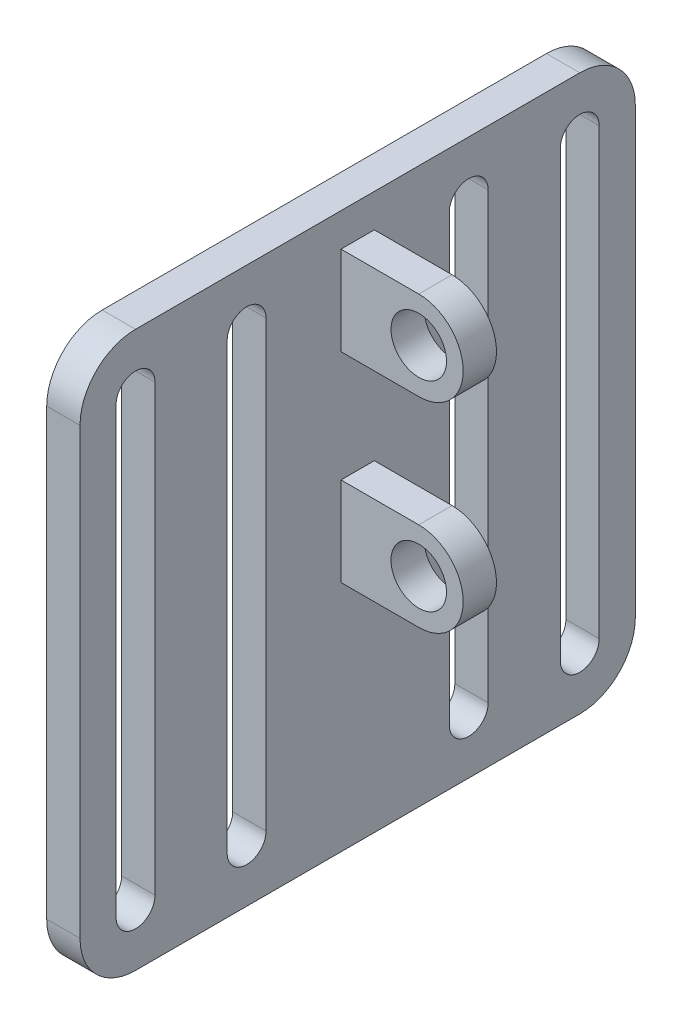
ISO-10303-21;
HEADER;
FILE_DESCRIPTION(('STEP AP214'),'2;1');
FILE_NAME('part.step','',(''),(''),'','','');
FILE_SCHEMA(('AUTOMOTIVE_DESIGN { 1 0 10303 214 1 1 1 1 }'));
ENDSEC;
DATA;
#1=APPLICATION_CONTEXT('core data for automotive mechanical design processes');
#2=APPLICATION_PROTOCOL_DEFINITION('international standard','automotive_design',2000,#1);
#3=PRODUCT_CONTEXT('',#1,'mechanical');
#4=PRODUCT('Part','Part','',(#3));
#5=PRODUCT_RELATED_PRODUCT_CATEGORY('part','',(#4));
#6=PRODUCT_DEFINITION_FORMATION('','',#4);
#7=PRODUCT_DEFINITION_CONTEXT('part definition',#1,'design');
#8=PRODUCT_DEFINITION('design','',#6,#7);
#9=PRODUCT_DEFINITION_SHAPE('','',#8);
#10=(LENGTH_UNIT() NAMED_UNIT(*) SI_UNIT(.MILLI.,.METRE.));
#11=(NAMED_UNIT(*) PLANE_ANGLE_UNIT() SI_UNIT($,.RADIAN.));
#12=(NAMED_UNIT(*) SI_UNIT($,.STERADIAN.) SOLID_ANGLE_UNIT());
#13=UNCERTAINTY_MEASURE_WITH_UNIT(LENGTH_MEASURE(1.E-05),#10,'distance_accuracy_value','');
#14=(GEOMETRIC_REPRESENTATION_CONTEXT(3) GLOBAL_UNCERTAINTY_ASSIGNED_CONTEXT((#13)) GLOBAL_UNIT_ASSIGNED_CONTEXT((#10,
#11,#12)) REPRESENTATION_CONTEXT('',''));
#15=CARTESIAN_POINT('',(0.,0.,0.));
#16=DIRECTION('',(0.,0.,1.));
#17=DIRECTION('',(1.,0.,0.));
#18=AXIS2_PLACEMENT_3D('',#15,#16,#17);
#19=CARTESIAN_POINT('',(3.,0.,-25.));
#20=DIRECTION('',(0.,0.,-1.));
#21=DIRECTION('',(0.,1.,0.));
#22=AXIS2_PLACEMENT_3D('',#19,#20,#21);
#23=PLANE('',#22);
#24=DIRECTION('',(0.,-1.,0.));
#25=VECTOR('',#24,1.);
#26=CARTESIAN_POINT('',(3.,0.,-25.));
#27=LINE('',#26,#25);
#28=CARTESIAN_POINT('',(3.,20.,-25.));
#29=VERTEX_POINT('',#28);
#30=CARTESIAN_POINT('',(3.,-20.,-25.));
#31=VERTEX_POINT('',#30);
#32=EDGE_CURVE('E375',#29,#31,#27,.T.);
#33=ORIENTED_EDGE('',*,*,#32,.T.);
#34=DIRECTION('',(-1.,0.,0.));
#35=VECTOR('',#34,1.);
#36=CARTESIAN_POINT('',(0.,-20.,-25.));
#37=LINE('',#36,#35);
#38=CARTESIAN_POINT('',(0.,-20.,-25.));
#39=VERTEX_POINT('',#38);
#40=EDGE_CURVE('E477',#31,#39,#37,.T.);
#41=ORIENTED_EDGE('',*,*,#40,.T.);
#42=DIRECTION('',(0.,-1.,0.));
#43=VECTOR('',#42,1.);
#44=CARTESIAN_POINT('',(0.,0.,-25.));
#45=LINE('',#44,#43);
#46=CARTESIAN_POINT('',(0.,20.,-25.));
#47=VERTEX_POINT('',#46);
#48=EDGE_CURVE('E434',#47,#39,#45,.T.);
#49=ORIENTED_EDGE('',*,*,#48,.F.);
#50=DIRECTION('',(-1.,0.,0.));
#51=VECTOR('',#50,1.);
#52=CARTESIAN_POINT('',(3.,20.,-25.));
#53=LINE('',#52,#51);
#54=EDGE_CURVE('E453',#47,#29,#53,.F.);
#55=ORIENTED_EDGE('',*,*,#54,.T.);
#56=EDGE_LOOP('',(#33,#41,#49,#55));
#57=FACE_BOUND('',#56,.T.);
#58=ADVANCED_FACE('F41',(#57),#23,.T.);
#59=CARTESIAN_POINT('',(3.,25.,0.));
#60=DIRECTION('',(0.,1.,0.));
#61=DIRECTION('',(0.,0.,1.));
#62=AXIS2_PLACEMENT_3D('',#59,#60,#61);
#63=PLANE('',#62);
#64=DIRECTION('',(0.,0.,-1.));
#65=VECTOR('',#64,1.);
#66=CARTESIAN_POINT('',(0.,25.,0.));
#67=LINE('',#66,#65);
#68=CARTESIAN_POINT('',(0.,25.,20.));
#69=VERTEX_POINT('',#68);
#70=CARTESIAN_POINT('',(0.,25.,-20.));
#71=VERTEX_POINT('',#70);
#72=EDGE_CURVE('E437',#69,#71,#67,.T.);
#73=ORIENTED_EDGE('',*,*,#72,.F.);
#74=DIRECTION('',(-1.,0.,0.));
#75=VECTOR('',#74,1.);
#76=CARTESIAN_POINT('',(3.,25.,20.));
#77=LINE('',#76,#75);
#78=CARTESIAN_POINT('',(3.,25.,20.));
#79=VERTEX_POINT('',#78);
#80=EDGE_CURVE('E11',#69,#79,#77,.F.);
#81=ORIENTED_EDGE('',*,*,#80,.T.);
#82=DIRECTION('',(0.,0.,-1.));
#83=VECTOR('',#82,1.);
#84=CARTESIAN_POINT('',(3.,25.,0.));
#85=LINE('',#84,#83);
#86=CARTESIAN_POINT('',(3.,25.,-20.));
#87=VERTEX_POINT('',#86);
#88=EDGE_CURVE('E378',#79,#87,#85,.T.);
#89=ORIENTED_EDGE('',*,*,#88,.T.);
#90=DIRECTION('',(-1.,0.,0.));
#91=VECTOR('',#90,1.);
#92=CARTESIAN_POINT('',(3.,25.,-20.));
#93=LINE('',#92,#91);
#94=EDGE_CURVE('E49',#87,#71,#93,.T.);
#95=ORIENTED_EDGE('',*,*,#94,.T.);
#96=EDGE_LOOP('',(#73,#81,#89,#95));
#97=FACE_BOUND('',#96,.T.);
#98=ADVANCED_FACE('F507',(#97),#63,.T.);
#99=CARTESIAN_POINT('',(3.,0.,25.));
#100=DIRECTION('',(0.,0.,-1.));
#101=DIRECTION('',(0.,1.,0.));
#102=AXIS2_PLACEMENT_3D('',#99,#100,#101);
#103=PLANE('',#102);
#104=DIRECTION('',(0.,-1.,0.));
#105=VECTOR('',#104,1.);
#106=CARTESIAN_POINT('',(0.,0.,25.));
#107=LINE('',#106,#105);
#108=CARTESIAN_POINT('',(0.,20.,25.));
#109=VERTEX_POINT('',#108);
#110=CARTESIAN_POINT('',(0.,-20.,25.));
#111=VERTEX_POINT('',#110);
#112=EDGE_CURVE('E440',#109,#111,#107,.T.);
#113=ORIENTED_EDGE('',*,*,#112,.T.);
#114=DIRECTION('',(-1.,0.,0.));
#115=VECTOR('',#114,1.);
#116=CARTESIAN_POINT('',(3.,-20.,25.));
#117=LINE('',#116,#115);
#118=CARTESIAN_POINT('',(3.,-20.,25.));
#119=VERTEX_POINT('',#118);
#120=EDGE_CURVE('E56',#111,#119,#117,.F.);
#121=ORIENTED_EDGE('',*,*,#120,.T.);
#122=DIRECTION('',(0.,-1.,0.));
#123=VECTOR('',#122,1.);
#124=CARTESIAN_POINT('',(3.,0.,25.));
#125=LINE('',#124,#123);
#126=CARTESIAN_POINT('',(3.,20.,25.));
#127=VERTEX_POINT('',#126);
#128=EDGE_CURVE('E381',#127,#119,#125,.T.);
#129=ORIENTED_EDGE('',*,*,#128,.F.);
#130=DIRECTION('',(-1.,0.,0.));
#131=VECTOR('',#130,1.);
#132=CARTESIAN_POINT('',(0.,20.,25.));
#133=LINE('',#132,#131);
#134=EDGE_CURVE('E500',#127,#109,#133,.T.);
#135=ORIENTED_EDGE('',*,*,#134,.T.);
#136=EDGE_LOOP('',(#113,#121,#129,#135));
#137=FACE_BOUND('',#136,.T.);
#138=ADVANCED_FACE('F518',(#137),#103,.F.);
#139=CARTESIAN_POINT('',(3.,-20.,20.));
#140=DIRECTION('',(-1.,0.,0.));
#141=DIRECTION('',(0.,0.,1.));
#142=AXIS2_PLACEMENT_3D('',#139,#140,#141);
#143=CYLINDRICAL_SURFACE('',#142,1.75);
#144=CARTESIAN_POINT('',(0.,-20.,20.));
#145=DIRECTION('',(1.,0.,0.));
#146=DIRECTION('',(0.,0.,-1.));
#147=AXIS2_PLACEMENT_3D('',#144,#145,#146);
#148=CIRCLE('',#147,1.75);
#149=CARTESIAN_POINT('',(0.,-20.,21.75));
#150=VERTEX_POINT('',#149);
#151=CARTESIAN_POINT('',(0.,-20.,18.25));
#152=VERTEX_POINT('',#151);
#153=EDGE_CURVE('E422',#150,#152,#148,.T.);
#154=ORIENTED_EDGE('',*,*,#153,.F.);
#155=DIRECTION('',(-1.,0.,0.));
#156=VECTOR('',#155,1.);
#157=CARTESIAN_POINT('',(3.,-20.,21.75));
#158=LINE('',#157,#156);
#159=CARTESIAN_POINT('',(3.,-20.,21.75));
#160=VERTEX_POINT('',#159);
#161=EDGE_CURVE('E451',#160,#150,#158,.T.);
#162=ORIENTED_EDGE('',*,*,#161,.F.);
#163=CARTESIAN_POINT('',(3.,-20.,20.));
#164=DIRECTION('',(1.,0.,0.));
#165=DIRECTION('',(0.,0.,-1.));
#166=AXIS2_PLACEMENT_3D('',#163,#164,#165);
#167=CIRCLE('',#166,1.75);
#168=CARTESIAN_POINT('',(3.,-20.,18.25));
#169=VERTEX_POINT('',#168);
#170=EDGE_CURVE('E363',#160,#169,#167,.T.);
#171=ORIENTED_EDGE('',*,*,#170,.T.);
#172=DIRECTION('',(-1.,0.,0.));
#173=VECTOR('',#172,1.);
#174=CARTESIAN_POINT('',(3.,-20.,18.25));
#175=LINE('',#174,#173);
#176=EDGE_CURVE('E444',#169,#152,#175,.T.);
#177=ORIENTED_EDGE('',*,*,#176,.T.);
#178=EDGE_LOOP('',(#154,#162,#171,#177));
#179=FACE_BOUND('',#178,.T.);
#180=ADVANCED_FACE('F563',(#179),#143,.F.);
#181=CARTESIAN_POINT('',(3.,0.,21.75));
#182=DIRECTION('',(0.,0.,-1.));
#183=DIRECTION('',(0.,1.,0.));
#184=AXIS2_PLACEMENT_3D('',#181,#182,#183);
#185=PLANE('',#184);
#186=DIRECTION('',(0.,-1.,0.));
#187=VECTOR('',#186,1.);
#188=CARTESIAN_POINT('',(0.,0.,21.75));
#189=LINE('',#188,#187);
#190=CARTESIAN_POINT('',(0.,20.,21.75));
#191=VERTEX_POINT('',#190);
#192=EDGE_CURVE('E425',#191,#150,#189,.T.);
#193=ORIENTED_EDGE('',*,*,#192,.F.);
#194=DIRECTION('',(-1.,0.,0.));
#195=VECTOR('',#194,1.);
#196=CARTESIAN_POINT('',(3.,20.,21.75));
#197=LINE('',#196,#195);
#198=CARTESIAN_POINT('',(3.,20.,21.75));
#199=VERTEX_POINT('',#198);
#200=EDGE_CURVE('E449',#199,#191,#197,.T.);
#201=ORIENTED_EDGE('',*,*,#200,.F.);
#202=DIRECTION('',(0.,-1.,0.));
#203=VECTOR('',#202,1.);
#204=CARTESIAN_POINT('',(3.,0.,21.75));
#205=LINE('',#204,#203);
#206=EDGE_CURVE('E366',#199,#160,#205,.T.);
#207=ORIENTED_EDGE('',*,*,#206,.T.);
#208=ORIENTED_EDGE('',*,*,#161,.T.);
#209=EDGE_LOOP('',(#193,#201,#207,#208));
#210=FACE_BOUND('',#209,.T.);
#211=ADVANCED_FACE('F559',(#210),#185,.T.);
#212=CARTESIAN_POINT('',(3.,20.,20.));
#213=DIRECTION('',(-1.,0.,0.));
#214=DIRECTION('',(0.,0.,1.));
#215=AXIS2_PLACEMENT_3D('',#212,#213,#214);
#216=CYLINDRICAL_SURFACE('',#215,1.75);
#217=CARTESIAN_POINT('',(0.,20.,20.));
#218=DIRECTION('',(1.,0.,0.));
#219=DIRECTION('',(0.,0.,-1.));
#220=AXIS2_PLACEMENT_3D('',#217,#218,#219);
#221=CIRCLE('',#220,1.75);
#222=CARTESIAN_POINT('',(0.,20.,18.25));
#223=VERTEX_POINT('',#222);
#224=EDGE_CURVE('E428',#223,#191,#221,.T.);
#225=ORIENTED_EDGE('',*,*,#224,.F.);
#226=DIRECTION('',(-1.,0.,0.));
#227=VECTOR('',#226,1.);
#228=CARTESIAN_POINT('',(3.,20.,18.25));
#229=LINE('',#228,#227);
#230=CARTESIAN_POINT('',(3.,20.,18.25));
#231=VERTEX_POINT('',#230);
#232=EDGE_CURVE('E446',#231,#223,#229,.T.);
#233=ORIENTED_EDGE('',*,*,#232,.F.);
#234=CARTESIAN_POINT('',(3.,20.,20.));
#235=DIRECTION('',(1.,0.,0.));
#236=DIRECTION('',(0.,0.,-1.));
#237=AXIS2_PLACEMENT_3D('',#234,#235,#236);
#238=CIRCLE('',#237,1.75);
#239=EDGE_CURVE('E369',#231,#199,#238,.T.);
#240=ORIENTED_EDGE('',*,*,#239,.T.);
#241=ORIENTED_EDGE('',*,*,#200,.T.);
#242=EDGE_LOOP('',(#225,#233,#240,#241));
#243=FACE_BOUND('',#242,.T.);
#244=ADVANCED_FACE('F555',(#243),#216,.F.);
#245=CARTESIAN_POINT('',(3.,-20.,10.));
#246=DIRECTION('',(-1.,0.,0.));
#247=DIRECTION('',(0.,0.,1.));
#248=AXIS2_PLACEMENT_3D('',#245,#246,#247);
#249=CYLINDRICAL_SURFACE('',#248,1.75);
#250=CARTESIAN_POINT('',(0.,-20.,10.));
#251=DIRECTION('',(1.,0.,0.));
#252=DIRECTION('',(0.,0.,-1.));
#253=AXIS2_PLACEMENT_3D('',#250,#251,#252);
#254=CIRCLE('',#253,1.75);
#255=CARTESIAN_POINT('',(0.,-20.,11.75));
#256=VERTEX_POINT('',#255);
#257=CARTESIAN_POINT('',(0.,-20.,8.25));
#258=VERTEX_POINT('',#257);
#259=EDGE_CURVE('E410',#256,#258,#254,.T.);
#260=ORIENTED_EDGE('',*,*,#259,.F.);
#261=DIRECTION('',(-1.,0.,0.));
#262=VECTOR('',#261,1.);
#263=CARTESIAN_POINT('',(3.,-20.,11.75));
#264=LINE('',#263,#262);
#265=CARTESIAN_POINT('',(3.,-20.,11.75));
#266=VERTEX_POINT('',#265);
#267=EDGE_CURVE('E447',#266,#256,#264,.T.);
#268=ORIENTED_EDGE('',*,*,#267,.F.);
#269=CARTESIAN_POINT('',(3.,-20.,10.));
#270=DIRECTION('',(1.,0.,0.));
#271=DIRECTION('',(0.,0.,-1.));
#272=AXIS2_PLACEMENT_3D('',#269,#270,#271);
#273=CIRCLE('',#272,1.75);
#274=CARTESIAN_POINT('',(3.,-20.,8.25));
#275=VERTEX_POINT('',#274);
#276=EDGE_CURVE('E352',#266,#275,#273,.T.);
#277=ORIENTED_EDGE('',*,*,#276,.T.);
#278=DIRECTION('',(-1.,0.,0.));
#279=VECTOR('',#278,1.);
#280=CARTESIAN_POINT('',(3.,-20.,8.25));
#281=LINE('',#280,#279);
#282=EDGE_CURVE('E454',#275,#258,#281,.T.);
#283=ORIENTED_EDGE('',*,*,#282,.T.);
#284=EDGE_LOOP('',(#260,#268,#277,#283));
#285=FACE_BOUND('',#284,.T.);
#286=ADVANCED_FACE('F558',(#285),#249,.F.);
#287=CARTESIAN_POINT('',(3.,0.,11.75));
#288=DIRECTION('',(0.,0.,-1.));
#289=DIRECTION('',(0.,1.,0.));
#290=AXIS2_PLACEMENT_3D('',#287,#288,#289);
#291=PLANE('',#290);
#292=DIRECTION('',(0.,-1.,0.));
#293=VECTOR('',#292,1.);
#294=CARTESIAN_POINT('',(0.,0.,11.75));
#295=LINE('',#294,#293);
#296=CARTESIAN_POINT('',(0.,20.,11.75));
#297=VERTEX_POINT('',#296);
#298=EDGE_CURVE('E413',#297,#256,#295,.T.);
#299=ORIENTED_EDGE('',*,*,#298,.F.);
#300=DIRECTION('',(-1.,0.,0.));
#301=VECTOR('',#300,1.);
#302=CARTESIAN_POINT('',(3.,20.,11.75));
#303=LINE('',#302,#301);
#304=CARTESIAN_POINT('',(3.,20.,11.75));
#305=VERTEX_POINT('',#304);
#306=EDGE_CURVE('E459',#305,#297,#303,.T.);
#307=ORIENTED_EDGE('',*,*,#306,.F.);
#308=DIRECTION('',(0.,-1.,0.));
#309=VECTOR('',#308,1.);
#310=CARTESIAN_POINT('',(3.,0.,11.75));
#311=LINE('',#310,#309);
#312=EDGE_CURVE('E355',#305,#266,#311,.T.);
#313=ORIENTED_EDGE('',*,*,#312,.T.);
#314=ORIENTED_EDGE('',*,*,#267,.T.);
#315=EDGE_LOOP('',(#299,#307,#313,#314));
#316=FACE_BOUND('',#315,.T.);
#317=ADVANCED_FACE('F576',(#316),#291,.T.);
#318=CARTESIAN_POINT('',(3.,20.,10.));
#319=DIRECTION('',(-1.,0.,0.));
#320=DIRECTION('',(0.,0.,1.));
#321=AXIS2_PLACEMENT_3D('',#318,#319,#320);
#322=CYLINDRICAL_SURFACE('',#321,1.75);
#323=CARTESIAN_POINT('',(0.,20.,10.));
#324=DIRECTION('',(1.,0.,0.));
#325=DIRECTION('',(0.,0.,-1.));
#326=AXIS2_PLACEMENT_3D('',#323,#324,#325);
#327=CIRCLE('',#326,1.75);
#328=CARTESIAN_POINT('',(0.,20.,8.25));
#329=VERTEX_POINT('',#328);
#330=EDGE_CURVE('E416',#329,#297,#327,.T.);
#331=ORIENTED_EDGE('',*,*,#330,.F.);
#332=DIRECTION('',(-1.,0.,0.));
#333=VECTOR('',#332,1.);
#334=CARTESIAN_POINT('',(3.,20.,8.25));
#335=LINE('',#334,#333);
#336=CARTESIAN_POINT('',(3.,20.,8.25));
#337=VERTEX_POINT('',#336);
#338=EDGE_CURVE('E456',#337,#329,#335,.T.);
#339=ORIENTED_EDGE('',*,*,#338,.F.);
#340=CARTESIAN_POINT('',(3.,20.,10.));
#341=DIRECTION('',(1.,0.,0.));
#342=DIRECTION('',(0.,0.,-1.));
#343=AXIS2_PLACEMENT_3D('',#340,#341,#342);
#344=CIRCLE('',#343,1.75);
#345=EDGE_CURVE('E358',#337,#305,#344,.T.);
#346=ORIENTED_EDGE('',*,*,#345,.T.);
#347=ORIENTED_EDGE('',*,*,#306,.T.);
#348=EDGE_LOOP('',(#331,#339,#346,#347));
#349=FACE_BOUND('',#348,.T.);
#350=ADVANCED_FACE('F572',(#349),#322,.F.);
#351=CARTESIAN_POINT('',(3.,20.,-20.));
#352=DIRECTION('',(-1.,0.,0.));
#353=DIRECTION('',(0.,0.,1.));
#354=AXIS2_PLACEMENT_3D('',#351,#352,#353);
#355=CYLINDRICAL_SURFACE('',#354,1.75);
#356=CARTESIAN_POINT('',(0.,20.,-20.));
#357=DIRECTION('',(1.,0.,0.));
#358=DIRECTION('',(0.,0.,-1.));
#359=AXIS2_PLACEMENT_3D('',#356,#357,#358);
#360=CIRCLE('',#359,1.75);
#361=CARTESIAN_POINT('',(0.,20.,-21.75));
#362=VERTEX_POINT('',#361);
#363=CARTESIAN_POINT('',(0.,20.,-18.25));
#364=VERTEX_POINT('',#363);
#365=EDGE_CURVE('E398',#362,#364,#360,.T.);
#366=ORIENTED_EDGE('',*,*,#365,.F.);
#367=DIRECTION('',(-1.,0.,0.));
#368=VECTOR('',#367,1.);
#369=CARTESIAN_POINT('',(3.,20.,-21.75));
#370=LINE('',#369,#368);
#371=CARTESIAN_POINT('',(3.,20.,-21.75));
#372=VERTEX_POINT('',#371);
#373=EDGE_CURVE('E457',#372,#362,#370,.T.);
#374=ORIENTED_EDGE('',*,*,#373,.F.);
#375=CARTESIAN_POINT('',(3.,20.,-20.));
#376=DIRECTION('',(1.,0.,0.));
#377=DIRECTION('',(0.,0.,-1.));
#378=AXIS2_PLACEMENT_3D('',#375,#376,#377);
#379=CIRCLE('',#378,1.75);
#380=CARTESIAN_POINT('',(3.,20.,-18.25));
#381=VERTEX_POINT('',#380);
#382=EDGE_CURVE('E340',#372,#381,#379,.T.);
#383=ORIENTED_EDGE('',*,*,#382,.T.);
#384=DIRECTION('',(-1.,0.,0.));
#385=VECTOR('',#384,1.);
#386=CARTESIAN_POINT('',(3.,20.,-18.25));
#387=LINE('',#386,#385);
#388=EDGE_CURVE('E462',#381,#364,#387,.T.);
#389=ORIENTED_EDGE('',*,*,#388,.T.);
#390=EDGE_LOOP('',(#366,#374,#383,#389));
#391=FACE_BOUND('',#390,.T.);
#392=ADVANCED_FACE('F575',(#391),#355,.F.);
#393=CARTESIAN_POINT('',(3.,0.,-21.75));
#394=DIRECTION('',(0.,0.,1.));
#395=DIRECTION('',(1.,0.,0.));
#396=AXIS2_PLACEMENT_3D('',#393,#394,#395);
#397=PLANE('',#396);
#398=DIRECTION('',(0.,1.,0.));
#399=VECTOR('',#398,1.);
#400=CARTESIAN_POINT('',(0.,0.,-21.75));
#401=LINE('',#400,#399);
#402=CARTESIAN_POINT('',(0.,-20.,-21.75));
#403=VERTEX_POINT('',#402);
#404=EDGE_CURVE('E401',#403,#362,#401,.T.);
#405=ORIENTED_EDGE('',*,*,#404,.F.);
#406=DIRECTION('',(-1.,0.,0.));
#407=VECTOR('',#406,1.);
#408=CARTESIAN_POINT('',(3.,-20.,-21.75));
#409=LINE('',#408,#407);
#410=CARTESIAN_POINT('',(3.,-20.,-21.75));
#411=VERTEX_POINT('',#410);
#412=EDGE_CURVE('E467',#411,#403,#409,.T.);
#413=ORIENTED_EDGE('',*,*,#412,.F.);
#414=DIRECTION('',(0.,1.,0.));
#415=VECTOR('',#414,1.);
#416=CARTESIAN_POINT('',(3.,0.,-21.75));
#417=LINE('',#416,#415);
#418=EDGE_CURVE('E343',#411,#372,#417,.T.);
#419=ORIENTED_EDGE('',*,*,#418,.T.);
#420=ORIENTED_EDGE('',*,*,#373,.T.);
#421=EDGE_LOOP('',(#405,#413,#419,#420));
#422=FACE_BOUND('',#421,.T.);
#423=ADVANCED_FACE('F592',(#422),#397,.T.);
#424=CARTESIAN_POINT('',(3.,-20.,-20.));
#425=DIRECTION('',(-1.,0.,0.));
#426=DIRECTION('',(0.,0.,1.));
#427=AXIS2_PLACEMENT_3D('',#424,#425,#426);
#428=CYLINDRICAL_SURFACE('',#427,1.75);
#429=CARTESIAN_POINT('',(0.,-20.,-20.));
#430=DIRECTION('',(1.,0.,0.));
#431=DIRECTION('',(0.,0.,-1.));
#432=AXIS2_PLACEMENT_3D('',#429,#430,#431);
#433=CIRCLE('',#432,1.75);
#434=CARTESIAN_POINT('',(0.,-20.,-18.25));
#435=VERTEX_POINT('',#434);
#436=EDGE_CURVE('E404',#435,#403,#433,.T.);
#437=ORIENTED_EDGE('',*,*,#436,.F.);
#438=DIRECTION('',(-1.,0.,0.));
#439=VECTOR('',#438,1.);
#440=CARTESIAN_POINT('',(3.,-20.,-18.25));
#441=LINE('',#440,#439);
#442=CARTESIAN_POINT('',(3.,-20.,-18.25));
#443=VERTEX_POINT('',#442);
#444=EDGE_CURVE('E464',#443,#435,#441,.T.);
#445=ORIENTED_EDGE('',*,*,#444,.F.);
#446=CARTESIAN_POINT('',(3.,-20.,-20.));
#447=DIRECTION('',(1.,0.,0.));
#448=DIRECTION('',(0.,0.,-1.));
#449=AXIS2_PLACEMENT_3D('',#446,#447,#448);
#450=CIRCLE('',#449,1.75);
#451=EDGE_CURVE('E346',#443,#411,#450,.T.);
#452=ORIENTED_EDGE('',*,*,#451,.T.);
#453=ORIENTED_EDGE('',*,*,#412,.T.);
#454=EDGE_LOOP('',(#437,#445,#452,#453));
#455=FACE_BOUND('',#454,.T.);
#456=ADVANCED_FACE('F588',(#455),#428,.F.);
#457=CARTESIAN_POINT('',(3.,20.,-10.));
#458=DIRECTION('',(-1.,0.,0.));
#459=DIRECTION('',(0.,0.,1.));
#460=AXIS2_PLACEMENT_3D('',#457,#458,#459);
#461=CYLINDRICAL_SURFACE('',#460,1.75);
#462=CARTESIAN_POINT('',(0.,20.,-10.));
#463=DIRECTION('',(1.,0.,0.));
#464=DIRECTION('',(0.,0.,-1.));
#465=AXIS2_PLACEMENT_3D('',#462,#463,#464);
#466=CIRCLE('',#465,1.75);
#467=CARTESIAN_POINT('',(0.,20.,-11.75));
#468=VERTEX_POINT('',#467);
#469=CARTESIAN_POINT('',(0.,20.,-8.25000000000001));
#470=VERTEX_POINT('',#469);
#471=EDGE_CURVE('E326',#468,#470,#466,.T.);
#472=ORIENTED_EDGE('',*,*,#471,.F.);
#473=DIRECTION('',(-1.,0.,0.));
#474=VECTOR('',#473,1.);
#475=CARTESIAN_POINT('',(3.,20.,-11.75));
#476=LINE('',#475,#474);
#477=CARTESIAN_POINT('',(3.,20.,-11.75));
#478=VERTEX_POINT('',#477);
#479=EDGE_CURVE('E465',#478,#468,#476,.T.);
#480=ORIENTED_EDGE('',*,*,#479,.F.);
#481=CARTESIAN_POINT('',(3.,20.,-10.));
#482=DIRECTION('',(1.,0.,0.));
#483=DIRECTION('',(0.,0.,-1.));
#484=AXIS2_PLACEMENT_3D('',#481,#482,#483);
#485=CIRCLE('',#484,1.75);
#486=CARTESIAN_POINT('',(3.,20.,-8.25000000000001));
#487=VERTEX_POINT('',#486);
#488=EDGE_CURVE('E327',#478,#487,#485,.T.);
#489=ORIENTED_EDGE('',*,*,#488,.T.);
#490=DIRECTION('',(-1.,0.,0.));
#491=VECTOR('',#490,1.);
#492=CARTESIAN_POINT('',(3.,20.,-8.25000000000001));
#493=LINE('',#492,#491);
#494=EDGE_CURVE('E386',#487,#470,#493,.T.);
#495=ORIENTED_EDGE('',*,*,#494,.T.);
#496=EDGE_LOOP('',(#472,#480,#489,#495));
#497=FACE_BOUND('',#496,.T.);
#498=ADVANCED_FACE('F591',(#497),#461,.F.);
#499=CARTESIAN_POINT('',(3.,0.,-11.75));
#500=DIRECTION('',(0.,0.,1.));
#501=DIRECTION('',(1.,0.,0.));
#502=AXIS2_PLACEMENT_3D('',#499,#500,#501);
#503=PLANE('',#502);
#504=DIRECTION('',(0.,1.,0.));
#505=VECTOR('',#504,1.);
#506=CARTESIAN_POINT('',(0.,0.,-11.75));
#507=LINE('',#506,#505);
#508=CARTESIAN_POINT('',(0.,-20.,-11.75));
#509=VERTEX_POINT('',#508);
#510=EDGE_CURVE('E389',#509,#468,#507,.T.);
#511=ORIENTED_EDGE('',*,*,#510,.F.);
#512=DIRECTION('',(-1.,0.,0.));
#513=VECTOR('',#512,1.);
#514=CARTESIAN_POINT('',(3.,-20.,-11.75));
#515=LINE('',#514,#513);
#516=CARTESIAN_POINT('',(3.,-20.,-11.75));
#517=VERTEX_POINT('',#516);
#518=EDGE_CURVE('E473',#517,#509,#515,.T.);
#519=ORIENTED_EDGE('',*,*,#518,.F.);
#520=DIRECTION('',(0.,1.,0.));
#521=VECTOR('',#520,1.);
#522=CARTESIAN_POINT('',(3.,0.,-11.75));
#523=LINE('',#522,#521);
#524=EDGE_CURVE('E330',#517,#478,#523,.T.);
#525=ORIENTED_EDGE('',*,*,#524,.T.);
#526=ORIENTED_EDGE('',*,*,#479,.T.);
#527=EDGE_LOOP('',(#511,#519,#525,#526));
#528=FACE_BOUND('',#527,.T.);
#529=ADVANCED_FACE('F605',(#528),#503,.T.);
#530=CARTESIAN_POINT('',(3.,-20.,-10.));
#531=DIRECTION('',(-1.,0.,0.));
#532=DIRECTION('',(0.,0.,1.));
#533=AXIS2_PLACEMENT_3D('',#530,#531,#532);
#534=CYLINDRICAL_SURFACE('',#533,1.75);
#535=CARTESIAN_POINT('',(0.,-20.,-10.));
#536=DIRECTION('',(1.,0.,0.));
#537=DIRECTION('',(0.,0.,-1.));
#538=AXIS2_PLACEMENT_3D('',#535,#536,#537);
#539=CIRCLE('',#538,1.75);
#540=CARTESIAN_POINT('',(0.,-20.,-8.25000000000001));
#541=VERTEX_POINT('',#540);
#542=EDGE_CURVE('E392',#541,#509,#539,.T.);
#543=ORIENTED_EDGE('',*,*,#542,.F.);
#544=DIRECTION('',(-1.,0.,0.));
#545=VECTOR('',#544,1.);
#546=CARTESIAN_POINT('',(3.,-20.,-8.25000000000001));
#547=LINE('',#546,#545);
#548=CARTESIAN_POINT('',(3.,-20.,-8.25000000000001));
#549=VERTEX_POINT('',#548);
#550=EDGE_CURVE('E471',#549,#541,#547,.T.);
#551=ORIENTED_EDGE('',*,*,#550,.F.);
#552=CARTESIAN_POINT('',(3.,-20.,-10.));
#553=DIRECTION('',(1.,0.,0.));
#554=DIRECTION('',(0.,0.,-1.));
#555=AXIS2_PLACEMENT_3D('',#552,#553,#554);
#556=CIRCLE('',#555,1.75);
#557=EDGE_CURVE('E334',#549,#517,#556,.T.);
#558=ORIENTED_EDGE('',*,*,#557,.T.);
#559=ORIENTED_EDGE('',*,*,#518,.T.);
#560=EDGE_LOOP('',(#543,#551,#558,#559));
#561=FACE_BOUND('',#560,.T.);
#562=ADVANCED_FACE('F553',(#561),#534,.F.);
#563=CARTESIAN_POINT('',(3.,0.,18.25));
#564=DIRECTION('',(0.,0.,1.));
#565=DIRECTION('',(0.,-1.,0.));
#566=AXIS2_PLACEMENT_3D('',#563,#564,#565);
#567=PLANE('',#566);
#568=DIRECTION('',(0.,1.,0.));
#569=VECTOR('',#568,1.);
#570=CARTESIAN_POINT('',(0.,0.,18.25));
#571=LINE('',#570,#569);
#572=EDGE_CURVE('E431',#152,#223,#571,.T.);
#573=ORIENTED_EDGE('',*,*,#572,.F.);
#574=ORIENTED_EDGE('',*,*,#176,.F.);
#575=DIRECTION('',(0.,1.,0.));
#576=VECTOR('',#575,1.);
#577=CARTESIAN_POINT('',(3.,0.,18.25));
#578=LINE('',#577,#576);
#579=EDGE_CURVE('E372',#169,#231,#578,.T.);
#580=ORIENTED_EDGE('',*,*,#579,.T.);
#581=ORIENTED_EDGE('',*,*,#232,.T.);
#582=EDGE_LOOP('',(#573,#574,#580,#581));
#583=FACE_BOUND('',#582,.T.);
#584=ADVANCED_FACE('F549',(#583),#567,.T.);
#585=CARTESIAN_POINT('',(3.,0.,8.25));
#586=DIRECTION('',(0.,0.,-1.));
#587=DIRECTION('',(0.,1.,0.));
#588=AXIS2_PLACEMENT_3D('',#585,#586,#587);
#589=PLANE('',#588);
#590=DIRECTION('',(0.,-1.,0.));
#591=VECTOR('',#590,1.);
#592=CARTESIAN_POINT('',(0.,0.,8.25));
#593=LINE('',#592,#591);
#594=EDGE_CURVE('E419',#329,#258,#593,.T.);
#595=ORIENTED_EDGE('',*,*,#594,.T.);
#596=ORIENTED_EDGE('',*,*,#282,.F.);
#597=DIRECTION('',(0.,-1.,0.));
#598=VECTOR('',#597,1.);
#599=CARTESIAN_POINT('',(3.,0.,8.25));
#600=LINE('',#599,#598);
#601=EDGE_CURVE('E361',#337,#275,#600,.T.);
#602=ORIENTED_EDGE('',*,*,#601,.F.);
#603=ORIENTED_EDGE('',*,*,#338,.T.);
#604=EDGE_LOOP('',(#595,#596,#602,#603));
#605=FACE_BOUND('',#604,.T.);
#606=ADVANCED_FACE('F552',(#605),#589,.F.);
#607=CARTESIAN_POINT('',(3.,0.,-18.25));
#608=DIRECTION('',(0.,0.,-1.));
#609=DIRECTION('',(-1.,0.,0.));
#610=AXIS2_PLACEMENT_3D('',#607,#608,#609);
#611=PLANE('',#610);
#612=DIRECTION('',(0.,-1.,0.));
#613=VECTOR('',#612,1.);
#614=CARTESIAN_POINT('',(0.,0.,-18.25));
#615=LINE('',#614,#613);
#616=EDGE_CURVE('E407',#364,#435,#615,.T.);
#617=ORIENTED_EDGE('',*,*,#616,.F.);
#618=ORIENTED_EDGE('',*,*,#388,.F.);
#619=DIRECTION('',(0.,-1.,0.));
#620=VECTOR('',#619,1.);
#621=CARTESIAN_POINT('',(3.,0.,-18.25));
#622=LINE('',#621,#620);
#623=EDGE_CURVE('E349',#381,#443,#622,.T.);
#624=ORIENTED_EDGE('',*,*,#623,.T.);
#625=ORIENTED_EDGE('',*,*,#444,.T.);
#626=EDGE_LOOP('',(#617,#618,#624,#625));
#627=FACE_BOUND('',#626,.T.);
#628=ADVANCED_FACE('F570',(#627),#611,.T.);
#629=CARTESIAN_POINT('',(3.,0.,-8.25000000000001));
#630=DIRECTION('',(0.,0.,-1.));
#631=DIRECTION('',(-1.,0.,0.));
#632=AXIS2_PLACEMENT_3D('',#629,#630,#631);
#633=PLANE('',#632);
#634=DIRECTION('',(0.,-1.,0.));
#635=VECTOR('',#634,1.);
#636=CARTESIAN_POINT('',(0.,0.,-8.25000000000001));
#637=LINE('',#636,#635);
#638=EDGE_CURVE('E395',#470,#541,#637,.T.);
#639=ORIENTED_EDGE('',*,*,#638,.F.);
#640=ORIENTED_EDGE('',*,*,#494,.F.);
#641=DIRECTION('',(0.,-1.,0.));
#642=VECTOR('',#641,1.);
#643=CARTESIAN_POINT('',(3.,0.,-8.25000000000001));
#644=LINE('',#643,#642);
#645=EDGE_CURVE('E337',#487,#549,#644,.T.);
#646=ORIENTED_EDGE('',*,*,#645,.T.);
#647=ORIENTED_EDGE('',*,*,#550,.T.);
#648=EDGE_LOOP('',(#639,#640,#646,#647));
#649=FACE_BOUND('',#648,.T.);
#650=ADVANCED_FACE('F586',(#649),#633,.T.);
#651=CARTESIAN_POINT('',(3.,-25.,0.));
#652=DIRECTION('',(0.,1.,0.));
#653=DIRECTION('',(0.,0.,1.));
#654=AXIS2_PLACEMENT_3D('',#651,#652,#653);
#655=PLANE('',#654);
#656=DIRECTION('',(0.,0.,-1.));
#657=VECTOR('',#656,1.);
#658=CARTESIAN_POINT('',(0.,-25.,0.));
#659=LINE('',#658,#657);
#660=CARTESIAN_POINT('',(0.,-25.,20.));
#661=VERTEX_POINT('',#660);
#662=CARTESIAN_POINT('',(0.,-25.,-20.));
#663=VERTEX_POINT('',#662);
#664=EDGE_CURVE('E331',#661,#663,#659,.T.);
#665=ORIENTED_EDGE('',*,*,#664,.T.);
#666=DIRECTION('',(-1.,0.,0.));
#667=VECTOR('',#666,1.);
#668=CARTESIAN_POINT('',(3.,-25.,-20.));
#669=LINE('',#668,#667);
#670=CARTESIAN_POINT('',(3.,-25.,-20.));
#671=VERTEX_POINT('',#670);
#672=EDGE_CURVE('E491',#663,#671,#669,.F.);
#673=ORIENTED_EDGE('',*,*,#672,.T.);
#674=DIRECTION('',(0.,0.,-1.));
#675=VECTOR('',#674,1.);
#676=CARTESIAN_POINT('',(3.,-25.,0.));
#677=LINE('',#676,#675);
#678=CARTESIAN_POINT('',(3.,-25.,20.));
#679=VERTEX_POINT('',#678);
#680=EDGE_CURVE('E383',#679,#671,#677,.T.);
#681=ORIENTED_EDGE('',*,*,#680,.F.);
#682=DIRECTION('',(-1.,0.,0.));
#683=VECTOR('',#682,1.);
#684=CARTESIAN_POINT('',(3.,-25.,20.));
#685=LINE('',#684,#683);
#686=EDGE_CURVE('E488',#679,#661,#685,.T.);
#687=ORIENTED_EDGE('',*,*,#686,.T.);
#688=EDGE_LOOP('',(#665,#673,#681,#687));
#689=FACE_BOUND('',#688,.T.);
#690=ADVANCED_FACE('F527',(#689),#655,.F.);
#691=CARTESIAN_POINT('',(3.,0.,0.));
#692=DIRECTION('',(1.,0.,0.));
#693=DIRECTION('',(0.,0.,-1.));
#694=AXIS2_PLACEMENT_3D('',#691,#692,#693);
#695=PLANE('',#694);
#696=DIRECTION('',(0.,-1.,0.));
#697=VECTOR('',#696,1.);
#698=CARTESIAN_POINT('',(3.,0.,1.5));
#699=LINE('',#698,#697);
#700=CARTESIAN_POINT('',(3.,4.,1.5));
#701=VERTEX_POINT('',#700);
#702=CARTESIAN_POINT('',(3.,-4.,1.5));
#703=VERTEX_POINT('',#702);
#704=EDGE_CURVE('E279',#701,#703,#699,.T.);
#705=ORIENTED_EDGE('',*,*,#704,.F.);
#706=DIRECTION('',(0.,0.,1.));
#707=VECTOR('',#706,1.);
#708=CARTESIAN_POINT('',(3.,4.,0.));
#709=LINE('',#708,#707);
#710=CARTESIAN_POINT('',(3.,4.,-1.5));
#711=VERTEX_POINT('',#710);
#712=EDGE_CURVE('E259',#711,#701,#709,.T.);
#713=ORIENTED_EDGE('',*,*,#712,.F.);
#714=DIRECTION('',(0.,-1.,0.));
#715=VECTOR('',#714,1.);
#716=CARTESIAN_POINT('',(3.,0.,-1.5));
#717=LINE('',#716,#715);
#718=CARTESIAN_POINT('',(3.,-4.,-1.5));
#719=VERTEX_POINT('',#718);
#720=EDGE_CURVE('E275',#711,#719,#717,.T.);
#721=ORIENTED_EDGE('',*,*,#720,.T.);
#722=DIRECTION('',(0.,0.,-1.));
#723=VECTOR('',#722,1.);
#724=CARTESIAN_POINT('',(3.,-4.,0.));
#725=LINE('',#724,#723);
#726=EDGE_CURVE('E285',#703,#719,#725,.T.);
#727=ORIENTED_EDGE('',*,*,#726,.F.);
#728=EDGE_LOOP('',(#705,#713,#721,#727));
#729=FACE_BOUND('',#728,.T.);
#730=DIRECTION('',(0.,-1.,0.));
#731=VECTOR('',#730,1.);
#732=CARTESIAN_POINT('',(3.,0.,1.5));
#733=LINE('',#732,#731);
#734=CARTESIAN_POINT('',(3.,22.,1.5));
#735=VERTEX_POINT('',#734);
#736=CARTESIAN_POINT('',(3.,14.,1.5));
#737=VERTEX_POINT('',#736);
#738=EDGE_CURVE('E318',#735,#737,#733,.T.);
#739=ORIENTED_EDGE('',*,*,#738,.F.);
#740=DIRECTION('',(0.,0.,-1.));
#741=VECTOR('',#740,1.);
#742=CARTESIAN_POINT('',(3.,22.,0.));
#743=LINE('',#742,#741);
#744=CARTESIAN_POINT('',(3.,22.,-1.5));
#745=VERTEX_POINT('',#744);
#746=EDGE_CURVE('E320',#735,#745,#743,.T.);
#747=ORIENTED_EDGE('',*,*,#746,.T.);
#748=DIRECTION('',(0.,-1.,0.));
#749=VECTOR('',#748,1.);
#750=CARTESIAN_POINT('',(3.,0.,-1.5));
#751=LINE('',#750,#749);
#752=CARTESIAN_POINT('',(3.,14.,-1.5));
#753=VERTEX_POINT('',#752);
#754=EDGE_CURVE('E315',#745,#753,#751,.T.);
#755=ORIENTED_EDGE('',*,*,#754,.T.);
#756=DIRECTION('',(0.,0.,-1.));
#757=VECTOR('',#756,1.);
#758=CARTESIAN_POINT('',(3.,14.,0.));
#759=LINE('',#758,#757);
#760=EDGE_CURVE('E323',#737,#753,#759,.T.);
#761=ORIENTED_EDGE('',*,*,#760,.F.);
#762=EDGE_LOOP('',(#739,#747,#755,#761));
#763=FACE_BOUND('',#762,.T.);
#764=ORIENTED_EDGE('',*,*,#488,.F.);
#765=ORIENTED_EDGE('',*,*,#524,.F.);
#766=ORIENTED_EDGE('',*,*,#557,.F.);
#767=ORIENTED_EDGE('',*,*,#645,.F.);
#768=EDGE_LOOP('',(#764,#765,#766,#767));
#769=FACE_BOUND('',#768,.T.);
#770=ORIENTED_EDGE('',*,*,#382,.F.);
#771=ORIENTED_EDGE('',*,*,#418,.F.);
#772=ORIENTED_EDGE('',*,*,#451,.F.);
#773=ORIENTED_EDGE('',*,*,#623,.F.);
#774=EDGE_LOOP('',(#770,#771,#772,#773));
#775=FACE_BOUND('',#774,.T.);
#776=ORIENTED_EDGE('',*,*,#276,.F.);
#777=ORIENTED_EDGE('',*,*,#312,.F.);
#778=ORIENTED_EDGE('',*,*,#345,.F.);
#779=ORIENTED_EDGE('',*,*,#601,.T.);
#780=EDGE_LOOP('',(#776,#777,#778,#779));
#781=FACE_BOUND('',#780,.T.);
#782=ORIENTED_EDGE('',*,*,#170,.F.);
#783=ORIENTED_EDGE('',*,*,#206,.F.);
#784=ORIENTED_EDGE('',*,*,#239,.F.);
#785=ORIENTED_EDGE('',*,*,#579,.F.);
#786=EDGE_LOOP('',(#782,#783,#784,#785));
#787=FACE_BOUND('',#786,.T.);
#788=ORIENTED_EDGE('',*,*,#680,.T.);
#789=CARTESIAN_POINT('',(3.,-20.,-20.));
#790=DIRECTION('',(1.,0.,0.));
#791=DIRECTION('',(0.,0.,-1.));
#792=AXIS2_PLACEMENT_3D('',#789,#790,#791);
#793=CIRCLE('',#792,5.);
#794=EDGE_CURVE('E498',#671,#31,#793,.T.);
#795=ORIENTED_EDGE('',*,*,#794,.T.);
#796=ORIENTED_EDGE('',*,*,#32,.F.);
#797=CARTESIAN_POINT('',(3.,20.,-20.));
#798=DIRECTION('',(1.,0.,0.));
#799=DIRECTION('',(0.,0.,-1.));
#800=AXIS2_PLACEMENT_3D('',#797,#798,#799);
#801=CIRCLE('',#800,5.);
#802=EDGE_CURVE('E493',#29,#87,#801,.T.);
#803=ORIENTED_EDGE('',*,*,#802,.T.);
#804=ORIENTED_EDGE('',*,*,#88,.F.);
#805=CARTESIAN_POINT('',(3.,20.,20.));
#806=DIRECTION('',(1.,0.,0.));
#807=DIRECTION('',(0.,0.,-1.));
#808=AXIS2_PLACEMENT_3D('',#805,#806,#807);
#809=CIRCLE('',#808,5.);
#810=EDGE_CURVE('E63',#79,#127,#809,.T.);
#811=ORIENTED_EDGE('',*,*,#810,.T.);
#812=ORIENTED_EDGE('',*,*,#128,.T.);
#813=CARTESIAN_POINT('',(3.,-20.,20.));
#814=DIRECTION('',(1.,0.,0.));
#815=DIRECTION('',(0.,0.,-1.));
#816=AXIS2_PLACEMENT_3D('',#813,#814,#815);
#817=CIRCLE('',#816,5.);
#818=EDGE_CURVE('E496',#119,#679,#817,.T.);
#819=ORIENTED_EDGE('',*,*,#818,.T.);
#820=EDGE_LOOP('',(#788,#795,#796,#803,#804,#811,#812,#819));
#821=FACE_BOUND('',#820,.T.);
#822=ADVANCED_FACE('F520',(#729,#763,#769,#775,#781,#787,#821),#695,.T.);
#823=CARTESIAN_POINT('',(0.,0.,0.));
#824=DIRECTION('',(1.,0.,0.));
#825=DIRECTION('',(0.,0.,-1.));
#826=AXIS2_PLACEMENT_3D('',#823,#824,#825);
#827=PLANE('',#826);
#828=ORIENTED_EDGE('',*,*,#471,.T.);
#829=ORIENTED_EDGE('',*,*,#638,.T.);
#830=ORIENTED_EDGE('',*,*,#542,.T.);
#831=ORIENTED_EDGE('',*,*,#510,.T.);
#832=EDGE_LOOP('',(#828,#829,#830,#831));
#833=FACE_BOUND('',#832,.T.);
#834=ORIENTED_EDGE('',*,*,#365,.T.);
#835=ORIENTED_EDGE('',*,*,#616,.T.);
#836=ORIENTED_EDGE('',*,*,#436,.T.);
#837=ORIENTED_EDGE('',*,*,#404,.T.);
#838=EDGE_LOOP('',(#834,#835,#836,#837));
#839=FACE_BOUND('',#838,.T.);
#840=ORIENTED_EDGE('',*,*,#259,.T.);
#841=ORIENTED_EDGE('',*,*,#594,.F.);
#842=ORIENTED_EDGE('',*,*,#330,.T.);
#843=ORIENTED_EDGE('',*,*,#298,.T.);
#844=EDGE_LOOP('',(#840,#841,#842,#843));
#845=FACE_BOUND('',#844,.T.);
#846=ORIENTED_EDGE('',*,*,#153,.T.);
#847=ORIENTED_EDGE('',*,*,#572,.T.);
#848=ORIENTED_EDGE('',*,*,#224,.T.);
#849=ORIENTED_EDGE('',*,*,#192,.T.);
#850=EDGE_LOOP('',(#846,#847,#848,#849));
#851=FACE_BOUND('',#850,.T.);
#852=ORIENTED_EDGE('',*,*,#48,.T.);
#853=CARTESIAN_POINT('',(0.,-20.,-20.));
#854=DIRECTION('',(1.,0.,0.));
#855=DIRECTION('',(0.,0.,-1.));
#856=AXIS2_PLACEMENT_3D('',#853,#854,#855);
#857=CIRCLE('',#856,5.);
#858=EDGE_CURVE('E486',#39,#663,#857,.F.);
#859=ORIENTED_EDGE('',*,*,#858,.T.);
#860=ORIENTED_EDGE('',*,*,#664,.F.);
#861=CARTESIAN_POINT('',(0.,-20.,20.));
#862=DIRECTION('',(1.,0.,0.));
#863=DIRECTION('',(0.,0.,-1.));
#864=AXIS2_PLACEMENT_3D('',#861,#862,#863);
#865=CIRCLE('',#864,5.);
#866=EDGE_CURVE('E484',#661,#111,#865,.F.);
#867=ORIENTED_EDGE('',*,*,#866,.T.);
#868=ORIENTED_EDGE('',*,*,#112,.F.);
#869=CARTESIAN_POINT('',(0.,20.,20.));
#870=DIRECTION('',(1.,0.,0.));
#871=DIRECTION('',(0.,0.,-1.));
#872=AXIS2_PLACEMENT_3D('',#869,#870,#871);
#873=CIRCLE('',#872,5.);
#874=EDGE_CURVE('E482',#109,#69,#873,.F.);
#875=ORIENTED_EDGE('',*,*,#874,.T.);
#876=ORIENTED_EDGE('',*,*,#72,.T.);
#877=CARTESIAN_POINT('',(0.,20.,-20.));
#878=DIRECTION('',(1.,0.,0.));
#879=DIRECTION('',(0.,0.,-1.));
#880=AXIS2_PLACEMENT_3D('',#877,#878,#879);
#881=CIRCLE('',#880,5.);
#882=EDGE_CURVE('E480',#71,#47,#881,.F.);
#883=ORIENTED_EDGE('',*,*,#882,.T.);
#884=EDGE_LOOP('',(#852,#859,#860,#867,#868,#875,#876,#883));
#885=FACE_BOUND('',#884,.T.);
#886=ADVANCED_FACE('F512',(#833,#839,#845,#851,#885),#827,.F.);
#887=CARTESIAN_POINT('',(0.,14.,1.5));
#888=DIRECTION('',(0.,-1.,0.));
#889=DIRECTION('',(0.,0.,-1.));
#890=AXIS2_PLACEMENT_3D('',#887,#888,#889);
#891=PLANE('',#890);
#892=DIRECTION('',(-1.,0.,0.));
#893=VECTOR('',#892,1.);
#894=CARTESIAN_POINT('',(0.,14.,1.5));
#895=LINE('',#894,#893);
#896=CARTESIAN_POINT('',(10.,14.,1.5));
#897=VERTEX_POINT('',#896);
#898=EDGE_CURVE('E290',#897,#737,#895,.T.);
#899=ORIENTED_EDGE('',*,*,#898,.T.);
#900=ORIENTED_EDGE('',*,*,#760,.T.);
#901=DIRECTION('',(-1.,0.,0.));
#902=VECTOR('',#901,1.);
#903=CARTESIAN_POINT('',(0.,14.,-1.5));
#904=LINE('',#903,#902);
#905=CARTESIAN_POINT('',(10.,14.,-1.5));
#906=VERTEX_POINT('',#905);
#907=EDGE_CURVE('E289',#906,#753,#904,.T.);
#908=ORIENTED_EDGE('',*,*,#907,.F.);
#909=DIRECTION('',(0.,0.,-1.));
#910=VECTOR('',#909,1.);
#911=CARTESIAN_POINT('',(10.,14.,1.5));
#912=LINE('',#911,#910);
#913=EDGE_CURVE('E313',#897,#906,#912,.T.);
#914=ORIENTED_EDGE('',*,*,#913,.F.);
#915=EDGE_LOOP('',(#899,#900,#908,#914));
#916=FACE_BOUND('',#915,.T.);
#917=ADVANCED_FACE('F778',(#916),#891,.T.);
#918=CARTESIAN_POINT('',(10.,18.,1.5));
#919=DIRECTION('',(0.,0.,-1.));
#920=DIRECTION('',(-1.,0.,0.));
#921=AXIS2_PLACEMENT_3D('',#918,#919,#920);
#922=CYLINDRICAL_SURFACE('',#921,4.);
#923=CARTESIAN_POINT('',(10.,18.,-1.5));
#924=DIRECTION('',(0.,0.,1.));
#925=DIRECTION('',(1.,0.,0.));
#926=AXIS2_PLACEMENT_3D('',#923,#924,#925);
#927=CIRCLE('',#926,4.);
#928=CARTESIAN_POINT('',(10.,22.,-1.5));
#929=VERTEX_POINT('',#928);
#930=EDGE_CURVE('E304',#906,#929,#927,.T.);
#931=ORIENTED_EDGE('',*,*,#930,.T.);
#932=DIRECTION('',(0.,0.,-1.));
#933=VECTOR('',#932,1.);
#934=CARTESIAN_POINT('',(10.,22.,1.5));
#935=LINE('',#934,#933);
#936=CARTESIAN_POINT('',(10.,22.,1.5));
#937=VERTEX_POINT('',#936);
#938=EDGE_CURVE('E302',#937,#929,#935,.T.);
#939=ORIENTED_EDGE('',*,*,#938,.F.);
#940=CARTESIAN_POINT('',(10.,18.,1.5));
#941=DIRECTION('',(0.,0.,1.));
#942=DIRECTION('',(1.,0.,0.));
#943=AXIS2_PLACEMENT_3D('',#940,#941,#942);
#944=CIRCLE('',#943,4.);
#945=EDGE_CURVE('E293',#897,#937,#944,.T.);
#946=ORIENTED_EDGE('',*,*,#945,.F.);
#947=ORIENTED_EDGE('',*,*,#913,.T.);
#948=EDGE_LOOP('',(#931,#939,#946,#947));
#949=FACE_BOUND('',#948,.T.);
#950=ADVANCED_FACE('F766',(#949),#922,.T.);
#951=CARTESIAN_POINT('',(0.,22.,1.5));
#952=DIRECTION('',(0.,-1.,0.));
#953=DIRECTION('',(0.,0.,-1.));
#954=AXIS2_PLACEMENT_3D('',#951,#952,#953);
#955=PLANE('',#954);
#956=ORIENTED_EDGE('',*,*,#746,.F.);
#957=DIRECTION('',(-1.,0.,0.));
#958=VECTOR('',#957,1.);
#959=CARTESIAN_POINT('',(0.,22.,1.5));
#960=LINE('',#959,#958);
#961=EDGE_CURVE('E296',#937,#735,#960,.T.);
#962=ORIENTED_EDGE('',*,*,#961,.F.);
#963=ORIENTED_EDGE('',*,*,#938,.T.);
#964=DIRECTION('',(-1.,0.,0.));
#965=VECTOR('',#964,1.);
#966=CARTESIAN_POINT('',(0.,22.,-1.5));
#967=LINE('',#966,#965);
#968=EDGE_CURVE('E306',#929,#745,#967,.T.);
#969=ORIENTED_EDGE('',*,*,#968,.T.);
#970=EDGE_LOOP('',(#956,#962,#963,#969));
#971=FACE_BOUND('',#970,.T.);
#972=ADVANCED_FACE('F754',(#971),#955,.F.);
#973=CARTESIAN_POINT('',(10.,18.,1.5));
#974=DIRECTION('',(0.,0.,-1.));
#975=DIRECTION('',(-1.,0.,0.));
#976=AXIS2_PLACEMENT_3D('',#973,#974,#975);
#977=CYLINDRICAL_SURFACE('',#976,2.5);
#978=CARTESIAN_POINT('',(10.,18.,1.5));
#979=DIRECTION('',(0.,0.,1.));
#980=DIRECTION('',(1.,0.,0.));
#981=AXIS2_PLACEMENT_3D('',#978,#979,#980);
#982=CIRCLE('',#981,2.5);
#983=CARTESIAN_POINT('',(12.5,18.,1.5));
#984=VERTEX_POINT('',#983);
#985=EDGE_CURVE('E299',#984,#984,#982,.T.);
#986=ORIENTED_EDGE('',*,*,#985,.T.);
#987=EDGE_LOOP('',(#986));
#988=FACE_BOUND('',#987,.T.);
#989=CARTESIAN_POINT('',(10.,18.,-1.5));
#990=DIRECTION('',(0.,0.,1.));
#991=DIRECTION('',(1.,0.,0.));
#992=AXIS2_PLACEMENT_3D('',#989,#990,#991);
#993=CIRCLE('',#992,2.5);
#994=CARTESIAN_POINT('',(12.5,18.,-1.5));
#995=VERTEX_POINT('',#994);
#996=EDGE_CURVE('E294',#995,#995,#993,.T.);
#997=ORIENTED_EDGE('',*,*,#996,.F.);
#998=EDGE_LOOP('',(#997));
#999=FACE_BOUND('',#998,.T.);
#1000=ADVANCED_FACE('F742',(#988,#999),#977,.F.);
#1001=CARTESIAN_POINT('',(0.,0.,1.5));
#1002=DIRECTION('',(0.,0.,1.));
#1003=DIRECTION('',(1.,0.,0.));
#1004=AXIS2_PLACEMENT_3D('',#1001,#1002,#1003);
#1005=PLANE('',#1004);
#1006=ORIENTED_EDGE('',*,*,#961,.T.);
#1007=ORIENTED_EDGE('',*,*,#738,.T.);
#1008=ORIENTED_EDGE('',*,*,#898,.F.);
#1009=ORIENTED_EDGE('',*,*,#945,.T.);
#1010=EDGE_LOOP('',(#1006,#1007,#1008,#1009));
#1011=FACE_BOUND('',#1010,.T.);
#1012=ORIENTED_EDGE('',*,*,#985,.F.);
#1013=EDGE_LOOP('',(#1012));
#1014=FACE_BOUND('',#1013,.T.);
#1015=ADVANCED_FACE('F730',(#1011,#1014),#1005,.T.);
#1016=CARTESIAN_POINT('',(0.,0.,-1.5));
#1017=DIRECTION('',(0.,0.,1.));
#1018=DIRECTION('',(1.,0.,0.));
#1019=AXIS2_PLACEMENT_3D('',#1016,#1017,#1018);
#1020=PLANE('',#1019);
#1021=ORIENTED_EDGE('',*,*,#754,.F.);
#1022=ORIENTED_EDGE('',*,*,#968,.F.);
#1023=ORIENTED_EDGE('',*,*,#930,.F.);
#1024=ORIENTED_EDGE('',*,*,#907,.T.);
#1025=EDGE_LOOP('',(#1021,#1022,#1023,#1024));
#1026=FACE_BOUND('',#1025,.T.);
#1027=ORIENTED_EDGE('',*,*,#996,.T.);
#1028=EDGE_LOOP('',(#1027));
#1029=FACE_BOUND('',#1028,.T.);
#1030=ADVANCED_FACE('F719',(#1026,#1029),#1020,.F.);
#1031=CARTESIAN_POINT('',(10.,0.,1.5));
#1032=DIRECTION('',(0.,0.,-1.));
#1033=DIRECTION('',(-1.,0.,0.));
#1034=AXIS2_PLACEMENT_3D('',#1031,#1032,#1033);
#1035=CYLINDRICAL_SURFACE('',#1034,4.);
#1036=CARTESIAN_POINT('',(10.,0.,-1.5));
#1037=DIRECTION('',(0.,0.,1.));
#1038=DIRECTION('',(1.,0.,0.));
#1039=AXIS2_PLACEMENT_3D('',#1036,#1037,#1038);
#1040=CIRCLE('',#1039,4.);
#1041=CARTESIAN_POINT('',(10.,-4.,-1.5));
#1042=VERTEX_POINT('',#1041);
#1043=CARTESIAN_POINT('',(10.,4.,-1.5));
#1044=VERTEX_POINT('',#1043);
#1045=EDGE_CURVE('E274',#1042,#1044,#1040,.T.);
#1046=ORIENTED_EDGE('',*,*,#1045,.T.);
#1047=DIRECTION('',(0.,0.,-1.));
#1048=VECTOR('',#1047,1.);
#1049=CARTESIAN_POINT('',(10.,4.,1.5));
#1050=LINE('',#1049,#1048);
#1051=CARTESIAN_POINT('',(10.,4.,1.5));
#1052=VERTEX_POINT('',#1051);
#1053=EDGE_CURVE('E256',#1052,#1044,#1050,.T.);
#1054=ORIENTED_EDGE('',*,*,#1053,.F.);
#1055=CARTESIAN_POINT('',(10.,0.,1.5));
#1056=DIRECTION('',(0.,0.,1.));
#1057=DIRECTION('',(1.,0.,0.));
#1058=AXIS2_PLACEMENT_3D('',#1055,#1056,#1057);
#1059=CIRCLE('',#1058,4.);
#1060=CARTESIAN_POINT('',(10.,-4.,1.5));
#1061=VERTEX_POINT('',#1060);
#1062=EDGE_CURVE('E263',#1061,#1052,#1059,.T.);
#1063=ORIENTED_EDGE('',*,*,#1062,.F.);
#1064=DIRECTION('',(0.,0.,-1.));
#1065=VECTOR('',#1064,1.);
#1066=CARTESIAN_POINT('',(10.,-4.,1.5));
#1067=LINE('',#1066,#1065);
#1068=EDGE_CURVE('E276',#1061,#1042,#1067,.T.);
#1069=ORIENTED_EDGE('',*,*,#1068,.T.);
#1070=EDGE_LOOP('',(#1046,#1054,#1063,#1069));
#1071=FACE_BOUND('',#1070,.T.);
#1072=ADVANCED_FACE('F272',(#1071),#1035,.T.);
#1073=CARTESIAN_POINT('',(0.,4.,1.5));
#1074=DIRECTION('',(0.,1.,0.));
#1075=DIRECTION('',(-1.,0.,0.));
#1076=AXIS2_PLACEMENT_3D('',#1073,#1074,#1075);
#1077=PLANE('',#1076);
#1078=DIRECTION('',(1.,0.,0.));
#1079=VECTOR('',#1078,1.);
#1080=CARTESIAN_POINT('',(0.,4.,-1.5));
#1081=LINE('',#1080,#1079);
#1082=EDGE_CURVE('E1117',#711,#1044,#1081,.T.);
#1083=ORIENTED_EDGE('',*,*,#1082,.F.);
#1084=ORIENTED_EDGE('',*,*,#712,.T.);
#1085=DIRECTION('',(1.,0.,0.));
#1086=VECTOR('',#1085,1.);
#1087=CARTESIAN_POINT('',(0.,4.,1.5));
#1088=LINE('',#1087,#1086);
#1089=EDGE_CURVE('E251',#701,#1052,#1088,.T.);
#1090=ORIENTED_EDGE('',*,*,#1089,.T.);
#1091=ORIENTED_EDGE('',*,*,#1053,.T.);
#1092=EDGE_LOOP('',(#1083,#1084,#1090,#1091));
#1093=FACE_BOUND('',#1092,.T.);
#1094=ADVANCED_FACE('F254',(#1093),#1077,.T.);
#1095=CARTESIAN_POINT('',(10.,0.,1.5));
#1096=DIRECTION('',(0.,0.,-1.));
#1097=DIRECTION('',(-1.,0.,0.));
#1098=AXIS2_PLACEMENT_3D('',#1095,#1096,#1097);
#1099=CYLINDRICAL_SURFACE('',#1098,2.5);
#1100=CARTESIAN_POINT('',(10.,0.,1.5));
#1101=DIRECTION('',(0.,0.,1.));
#1102=DIRECTION('',(1.,0.,0.));
#1103=AXIS2_PLACEMENT_3D('',#1100,#1101,#1102);
#1104=CIRCLE('',#1103,2.5);
#1105=CARTESIAN_POINT('',(12.5,0.,1.5));
#1106=VERTEX_POINT('',#1105);
#1107=EDGE_CURVE('E270',#1106,#1106,#1104,.T.);
#1108=ORIENTED_EDGE('',*,*,#1107,.T.);
#1109=EDGE_LOOP('',(#1108));
#1110=FACE_BOUND('',#1109,.T.);
#1111=CARTESIAN_POINT('',(10.,0.,-1.5));
#1112=DIRECTION('',(0.,0.,1.));
#1113=DIRECTION('',(1.,0.,0.));
#1114=AXIS2_PLACEMENT_3D('',#1111,#1112,#1113);
#1115=CIRCLE('',#1114,2.5);
#1116=CARTESIAN_POINT('',(12.5,0.,-1.5));
#1117=VERTEX_POINT('',#1116);
#1118=EDGE_CURVE('E1113',#1117,#1117,#1115,.T.);
#1119=ORIENTED_EDGE('',*,*,#1118,.F.);
#1120=EDGE_LOOP('',(#1119));
#1121=FACE_BOUND('',#1120,.T.);
#1122=ADVANCED_FACE('F686',(#1110,#1121),#1099,.F.);
#1123=CARTESIAN_POINT('',(0.,-4.,1.5));
#1124=DIRECTION('',(0.,-1.,0.));
#1125=DIRECTION('',(1.,0.,0.));
#1126=AXIS2_PLACEMENT_3D('',#1123,#1124,#1125);
#1127=PLANE('',#1126);
#1128=DIRECTION('',(-1.,0.,0.));
#1129=VECTOR('',#1128,1.);
#1130=CARTESIAN_POINT('',(0.,-4.,1.5));
#1131=LINE('',#1130,#1129);
#1132=EDGE_CURVE('E262',#1061,#703,#1131,.T.);
#1133=ORIENTED_EDGE('',*,*,#1132,.T.);
#1134=ORIENTED_EDGE('',*,*,#726,.T.);
#1135=DIRECTION('',(-1.,0.,0.));
#1136=VECTOR('',#1135,1.);
#1137=CARTESIAN_POINT('',(0.,-4.,-1.5));
#1138=LINE('',#1137,#1136);
#1139=EDGE_CURVE('E1118',#1042,#719,#1138,.T.);
#1140=ORIENTED_EDGE('',*,*,#1139,.F.);
#1141=ORIENTED_EDGE('',*,*,#1068,.F.);
#1142=EDGE_LOOP('',(#1133,#1134,#1140,#1141));
#1143=FACE_BOUND('',#1142,.T.);
#1144=ADVANCED_FACE('F674',(#1143),#1127,.T.);
#1145=CARTESIAN_POINT('',(0.,0.,1.5));
#1146=DIRECTION('',(0.,0.,1.));
#1147=DIRECTION('',(1.,0.,0.));
#1148=AXIS2_PLACEMENT_3D('',#1145,#1146,#1147);
#1149=PLANE('',#1148);
#1150=ORIENTED_EDGE('',*,*,#1107,.F.);
#1151=EDGE_LOOP('',(#1150));
#1152=FACE_BOUND('',#1151,.T.);
#1153=ORIENTED_EDGE('',*,*,#1089,.F.);
#1154=ORIENTED_EDGE('',*,*,#704,.T.);
#1155=ORIENTED_EDGE('',*,*,#1132,.F.);
#1156=ORIENTED_EDGE('',*,*,#1062,.T.);
#1157=EDGE_LOOP('',(#1153,#1154,#1155,#1156));
#1158=FACE_BOUND('',#1157,.T.);
#1159=ADVANCED_FACE('F267',(#1152,#1158),#1149,.T.);
#1160=CARTESIAN_POINT('',(0.,0.,-1.5));
#1161=DIRECTION('',(0.,0.,1.));
#1162=DIRECTION('',(1.,0.,0.));
#1163=AXIS2_PLACEMENT_3D('',#1160,#1161,#1162);
#1164=PLANE('',#1163);
#1165=ORIENTED_EDGE('',*,*,#720,.F.);
#1166=ORIENTED_EDGE('',*,*,#1082,.T.);
#1167=ORIENTED_EDGE('',*,*,#1045,.F.);
#1168=ORIENTED_EDGE('',*,*,#1139,.T.);
#1169=EDGE_LOOP('',(#1165,#1166,#1167,#1168));
#1170=FACE_BOUND('',#1169,.T.);
#1171=ORIENTED_EDGE('',*,*,#1118,.T.);
#1172=EDGE_LOOP('',(#1171));
#1173=FACE_BOUND('',#1172,.T.);
#1174=ADVANCED_FACE('F615',(#1170,#1173),#1164,.F.);
#1175=CARTESIAN_POINT('',(3.,-20.,-20.));
#1176=DIRECTION('',(1.,0.,0.));
#1177=DIRECTION('',(0.,0.,-1.));
#1178=AXIS2_PLACEMENT_3D('',#1175,#1176,#1177);
#1179=CYLINDRICAL_SURFACE('',#1178,5.);
#1180=ORIENTED_EDGE('',*,*,#794,.F.);
#1181=ORIENTED_EDGE('',*,*,#672,.F.);
#1182=ORIENTED_EDGE('',*,*,#858,.F.);
#1183=ORIENTED_EDGE('',*,*,#40,.F.);
#1184=EDGE_LOOP('',(#1180,#1181,#1182,#1183));
#1185=FACE_BOUND('',#1184,.T.);
#1186=ADVANCED_FACE('F532',(#1185),#1179,.T.);
#1187=CARTESIAN_POINT('',(3.,-20.,20.));
#1188=DIRECTION('',(-1.,0.,0.));
#1189=DIRECTION('',(0.,0.,1.));
#1190=AXIS2_PLACEMENT_3D('',#1187,#1188,#1189);
#1191=CYLINDRICAL_SURFACE('',#1190,5.);
#1192=ORIENTED_EDGE('',*,*,#818,.F.);
#1193=ORIENTED_EDGE('',*,*,#120,.F.);
#1194=ORIENTED_EDGE('',*,*,#866,.F.);
#1195=ORIENTED_EDGE('',*,*,#686,.F.);
#1196=EDGE_LOOP('',(#1192,#1193,#1194,#1195));
#1197=FACE_BOUND('',#1196,.T.);
#1198=ADVANCED_FACE('F524',(#1197),#1191,.T.);
#1199=CARTESIAN_POINT('',(3.,20.,20.));
#1200=DIRECTION('',(1.,0.,0.));
#1201=DIRECTION('',(0.,0.,-1.));
#1202=AXIS2_PLACEMENT_3D('',#1199,#1200,#1201);
#1203=CYLINDRICAL_SURFACE('',#1202,5.);
#1204=ORIENTED_EDGE('',*,*,#810,.F.);
#1205=ORIENTED_EDGE('',*,*,#80,.F.);
#1206=ORIENTED_EDGE('',*,*,#874,.F.);
#1207=ORIENTED_EDGE('',*,*,#134,.F.);
#1208=EDGE_LOOP('',(#1204,#1205,#1206,#1207));
#1209=FACE_BOUND('',#1208,.T.);
#1210=ADVANCED_FACE('F517',(#1209),#1203,.T.);
#1211=CARTESIAN_POINT('',(3.,20.,-20.));
#1212=DIRECTION('',(-1.,0.,0.));
#1213=DIRECTION('',(0.,0.,1.));
#1214=AXIS2_PLACEMENT_3D('',#1211,#1212,#1213);
#1215=CYLINDRICAL_SURFACE('',#1214,5.);
#1216=ORIENTED_EDGE('',*,*,#802,.F.);
#1217=ORIENTED_EDGE('',*,*,#54,.F.);
#1218=ORIENTED_EDGE('',*,*,#882,.F.);
#1219=ORIENTED_EDGE('',*,*,#94,.F.);
#1220=EDGE_LOOP('',(#1216,#1217,#1218,#1219));
#1221=FACE_BOUND('',#1220,.T.);
#1222=ADVANCED_FACE('F43',(#1221),#1215,.T.);
#1223=CLOSED_SHELL('',(#58,#98,#138,#180,#211,#244,#286,#317,#350,#392,#423,#456,#498,#529,#562,
#584,#606,#628,#650,#690,#822,#886,#917,#950,#972,#1000,#1015,#1030,#1072,#1094,#1122,#1144,
#1159,#1174,#1186,#1198,#1210,#1222));
#1224=MANIFOLD_SOLID_BREP('B2',#1223);
#1225=ADVANCED_BREP_SHAPE_REPRESENTATION('',(#18,#1224),#14);
#1226=SHAPE_DEFINITION_REPRESENTATION(#9,#1225);
ENDSEC;
END-ISO-10303-21;
